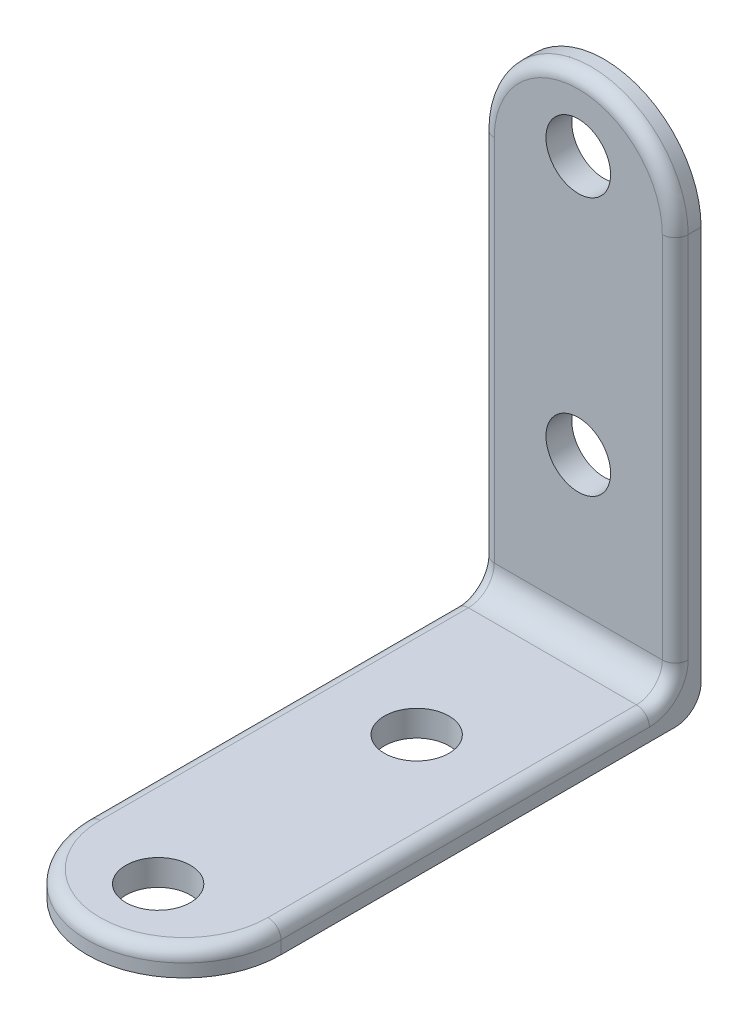
ISO-10303-21;
HEADER;
FILE_DESCRIPTION(('STEP AP214'),'2;1');
FILE_NAME('part.step','',(''),(''),'','','');
FILE_SCHEMA(('AUTOMOTIVE_DESIGN { 1 0 10303 214 1 1 1 1 }'));
ENDSEC;
DATA;
#1=APPLICATION_CONTEXT('core data for automotive mechanical design processes');
#2=APPLICATION_PROTOCOL_DEFINITION('international standard','automotive_design',2000,#1);
#3=PRODUCT_CONTEXT('',#1,'mechanical');
#4=PRODUCT('Part','Part','',(#3));
#5=PRODUCT_RELATED_PRODUCT_CATEGORY('part','',(#4));
#6=PRODUCT_DEFINITION_FORMATION('','',#4);
#7=PRODUCT_DEFINITION_CONTEXT('part definition',#1,'design');
#8=PRODUCT_DEFINITION('design','',#6,#7);
#9=PRODUCT_DEFINITION_SHAPE('','',#8);
#10=(LENGTH_UNIT() NAMED_UNIT(*) SI_UNIT(.MILLI.,.METRE.));
#11=(NAMED_UNIT(*) PLANE_ANGLE_UNIT() SI_UNIT($,.RADIAN.));
#12=(NAMED_UNIT(*) SI_UNIT($,.STERADIAN.) SOLID_ANGLE_UNIT());
#13=UNCERTAINTY_MEASURE_WITH_UNIT(LENGTH_MEASURE(1.E-05),#10,'distance_accuracy_value','');
#14=(GEOMETRIC_REPRESENTATION_CONTEXT(3) GLOBAL_UNCERTAINTY_ASSIGNED_CONTEXT((#13)) GLOBAL_UNIT_ASSIGNED_CONTEXT((#10,
#11,#12)) REPRESENTATION_CONTEXT('',''));
#15=CARTESIAN_POINT('',(0.,0.,0.));
#16=DIRECTION('',(0.,0.,1.));
#17=DIRECTION('',(1.,0.,0.));
#18=AXIS2_PLACEMENT_3D('',#15,#16,#17);
#19=CARTESIAN_POINT('',(0.,2.,0.));
#20=DIRECTION('',(0.,1.,0.));
#21=DIRECTION('',(0.,0.,1.));
#22=AXIS2_PLACEMENT_3D('',#19,#20,#21);
#23=PLANE('',#22);
#24=DIRECTION('',(-1.,0.,0.));
#25=VECTOR('',#24,1.);
#26=CARTESIAN_POINT('',(0.,2.,-28.5));
#27=LINE('',#26,#25);
#28=CARTESIAN_POINT('',(6.5,2.,-28.5));
#29=VERTEX_POINT('',#28);
#30=CARTESIAN_POINT('',(-6.5,2.,-28.5));
#31=VERTEX_POINT('',#30);
#32=EDGE_CURVE('E200',#29,#31,#27,.T.);
#33=ORIENTED_EDGE('',*,*,#32,.T.);
#34=DIRECTION('',(0.,0.,-1.));
#35=VECTOR('',#34,1.);
#36=CARTESIAN_POINT('',(-6.5,2.,0.));
#37=LINE('',#36,#35);
#38=CARTESIAN_POINT('',(-6.5,2.,0.));
#39=VERTEX_POINT('',#38);
#40=EDGE_CURVE('E216',#31,#39,#37,.F.);
#41=ORIENTED_EDGE('',*,*,#40,.T.);
#42=CARTESIAN_POINT('',(0.,2.,0.));
#43=DIRECTION('',(0.,1.,0.));
#44=DIRECTION('',(0.,0.,1.));
#45=AXIS2_PLACEMENT_3D('',#42,#43,#44);
#46=CIRCLE('',#45,6.5);
#47=CARTESIAN_POINT('',(6.5,2.,0.));
#48=VERTEX_POINT('',#47);
#49=EDGE_CURVE('E212',#39,#48,#46,.T.);
#50=ORIENTED_EDGE('',*,*,#49,.T.);
#51=DIRECTION('',(0.,0.,-1.));
#52=VECTOR('',#51,1.);
#53=CARTESIAN_POINT('',(6.5,2.,-28.5));
#54=LINE('',#53,#52);
#55=EDGE_CURVE('E214',#48,#29,#54,.T.);
#56=ORIENTED_EDGE('',*,*,#55,.T.);
#57=EDGE_LOOP('',(#33,#41,#50,#56));
#58=FACE_BOUND('',#57,.T.);
#59=CARTESIAN_POINT('',(0.,2.,2.));
#60=DIRECTION('',(0.,1.,0.));
#61=DIRECTION('',(0.,0.,1.));
#62=AXIS2_PLACEMENT_3D('',#59,#60,#61);
#63=CIRCLE('',#62,2.5);
#64=CARTESIAN_POINT('',(0.,2.,4.5));
#65=VERTEX_POINT('',#64);
#66=EDGE_CURVE('E168',#65,#65,#63,.T.);
#67=ORIENTED_EDGE('',*,*,#66,.F.);
#68=EDGE_LOOP('',(#67));
#69=FACE_BOUND('',#68,.T.);
#70=CARTESIAN_POINT('',(0.,2.,-18.));
#71=DIRECTION('',(0.,1.,0.));
#72=DIRECTION('',(0.,0.,1.));
#73=AXIS2_PLACEMENT_3D('',#70,#71,#72);
#74=CIRCLE('',#73,2.5);
#75=CARTESIAN_POINT('',(0.,2.,-15.5));
#76=VERTEX_POINT('',#75);
#77=EDGE_CURVE('E171',#76,#76,#74,.T.);
#78=ORIENTED_EDGE('',*,*,#77,.F.);
#79=EDGE_LOOP('',(#78));
#80=FACE_BOUND('',#79,.T.);
#81=ADVANCED_FACE('F40',(#58,#69,#80),#23,.T.);
#82=CARTESIAN_POINT('',(0.,2.,0.));
#83=DIRECTION('',(0.,-1.,0.));
#84=DIRECTION('',(0.,0.,-1.));
#85=AXIS2_PLACEMENT_3D('',#82,#83,#84);
#86=CYLINDRICAL_SURFACE('',#85,7.5);
#87=DIRECTION('',(0.,-1.,0.));
#88=VECTOR('',#87,1.);
#89=CARTESIAN_POINT('',(7.5,2.,0.));
#90=LINE('',#89,#88);
#91=CARTESIAN_POINT('',(7.5,1.,0.));
#92=VERTEX_POINT('',#91);
#93=CARTESIAN_POINT('',(7.5,0.,0.));
#94=VERTEX_POINT('',#93);
#95=EDGE_CURVE('E190',#92,#94,#90,.T.);
#96=ORIENTED_EDGE('',*,*,#95,.F.);
#97=CARTESIAN_POINT('',(0.,1.,0.));
#98=DIRECTION('',(0.,1.,0.));
#99=DIRECTION('',(0.,0.,1.));
#100=AXIS2_PLACEMENT_3D('',#97,#98,#99);
#101=CIRCLE('',#100,7.5);
#102=CARTESIAN_POINT('',(-7.5,1.,0.));
#103=VERTEX_POINT('',#102);
#104=EDGE_CURVE('E11',#92,#103,#101,.F.);
#105=ORIENTED_EDGE('',*,*,#104,.T.);
#106=DIRECTION('',(0.,-1.,0.));
#107=VECTOR('',#106,1.);
#108=CARTESIAN_POINT('',(-7.5,2.,0.));
#109=LINE('',#108,#107);
#110=CARTESIAN_POINT('',(-7.5,0.,0.));
#111=VERTEX_POINT('',#110);
#112=EDGE_CURVE('E152',#103,#111,#109,.T.);
#113=ORIENTED_EDGE('',*,*,#112,.T.);
#114=CARTESIAN_POINT('',(0.,0.,0.));
#115=DIRECTION('',(0.,1.,0.));
#116=DIRECTION('',(0.,0.,1.));
#117=AXIS2_PLACEMENT_3D('',#114,#115,#116);
#118=CIRCLE('',#117,7.5);
#119=EDGE_CURVE('E180',#111,#94,#118,.T.);
#120=ORIENTED_EDGE('',*,*,#119,.T.);
#121=EDGE_LOOP('',(#96,#105,#113,#120));
#122=FACE_BOUND('',#121,.T.);
#123=ADVANCED_FACE('F286',(#122),#86,.T.);
#124=CARTESIAN_POINT('',(7.5,2.,0.));
#125=DIRECTION('',(-1.,0.,0.));
#126=DIRECTION('',(0.,0.,1.));
#127=AXIS2_PLACEMENT_3D('',#124,#125,#126);
#128=PLANE('',#127);
#129=DIRECTION('',(0.,0.,-1.));
#130=VECTOR('',#129,1.);
#131=CARTESIAN_POINT('',(7.5,32.5,-30.5));
#132=LINE('',#131,#130);
#133=CARTESIAN_POINT('',(7.5,32.5,-31.5));
#134=VERTEX_POINT('',#133);
#135=CARTESIAN_POINT('',(7.5,32.5,-32.5));
#136=VERTEX_POINT('',#135);
#137=EDGE_CURVE('E140',#134,#136,#132,.T.);
#138=ORIENTED_EDGE('',*,*,#137,.F.);
#139=DIRECTION('',(0.,1.,0.));
#140=VECTOR('',#139,1.);
#141=CARTESIAN_POINT('',(7.5,2.,-31.5));
#142=LINE('',#141,#140);
#143=CARTESIAN_POINT('',(7.5,4.,-31.5));
#144=VERTEX_POINT('',#143);
#145=EDGE_CURVE('E49',#134,#144,#142,.F.);
#146=ORIENTED_EDGE('',*,*,#145,.T.);
#147=CARTESIAN_POINT('',(7.5,4.,-28.5));
#148=DIRECTION('',(-1.,0.,0.));
#149=DIRECTION('',(0.,0.,1.));
#150=AXIS2_PLACEMENT_3D('',#147,#148,#149);
#151=CIRCLE('',#150,3.);
#152=CARTESIAN_POINT('',(7.5,1.,-28.5));
#153=VERTEX_POINT('',#152);
#154=EDGE_CURVE('E61',#144,#153,#151,.T.);
#155=ORIENTED_EDGE('',*,*,#154,.T.);
#156=DIRECTION('',(0.,0.,-1.));
#157=VECTOR('',#156,1.);
#158=CARTESIAN_POINT('',(7.5,1.,0.));
#159=LINE('',#158,#157);
#160=EDGE_CURVE('E231',#153,#92,#159,.F.);
#161=ORIENTED_EDGE('',*,*,#160,.T.);
#162=ORIENTED_EDGE('',*,*,#95,.T.);
#163=DIRECTION('',(0.,0.,-1.));
#164=VECTOR('',#163,1.);
#165=CARTESIAN_POINT('',(7.5,0.,0.));
#166=LINE('',#165,#164);
#167=CARTESIAN_POINT('',(7.5,0.,-30.5));
#168=VERTEX_POINT('',#167);
#169=EDGE_CURVE('E183',#94,#168,#166,.T.);
#170=ORIENTED_EDGE('',*,*,#169,.T.);
#171=CARTESIAN_POINT('',(7.5,2.,-30.5));
#172=DIRECTION('',(-1.,0.,0.));
#173=DIRECTION('',(0.,0.,1.));
#174=AXIS2_PLACEMENT_3D('',#171,#172,#173);
#175=CIRCLE('',#174,2.);
#176=CARTESIAN_POINT('',(7.5,2.,-32.5));
#177=VERTEX_POINT('',#176);
#178=EDGE_CURVE('E195',#168,#177,#175,.F.);
#179=ORIENTED_EDGE('',*,*,#178,.T.);
#180=DIRECTION('',(0.,-1.,0.));
#181=VECTOR('',#180,1.);
#182=CARTESIAN_POINT('',(7.5,2.,-32.5));
#183=LINE('',#182,#181);
#184=EDGE_CURVE('E151',#136,#177,#183,.T.);
#185=ORIENTED_EDGE('',*,*,#184,.F.);
#186=EDGE_LOOP('',(#138,#146,#155,#161,#162,#170,#179,#185));
#187=FACE_BOUND('',#186,.T.);
#188=ADVANCED_FACE('F277',(#187),#128,.F.);
#189=CARTESIAN_POINT('',(0.,2.,-32.5));
#190=DIRECTION('',(0.,0.,-1.));
#191=DIRECTION('',(-1.,0.,0.));
#192=AXIS2_PLACEMENT_3D('',#189,#190,#191);
#193=PLANE('',#192);
#194=ORIENTED_EDGE('',*,*,#184,.T.);
#195=DIRECTION('',(1.,0.,0.));
#196=VECTOR('',#195,1.);
#197=CARTESIAN_POINT('',(-7.5,2.,-32.5));
#198=LINE('',#197,#196);
#199=CARTESIAN_POINT('',(-7.5,2.,-32.5));
#200=VERTEX_POINT('',#199);
#201=EDGE_CURVE('E150',#177,#200,#198,.F.);
#202=ORIENTED_EDGE('',*,*,#201,.T.);
#203=DIRECTION('',(0.,-1.,0.));
#204=VECTOR('',#203,1.);
#205=CARTESIAN_POINT('',(-7.5,2.,-32.5));
#206=LINE('',#205,#204);
#207=CARTESIAN_POINT('',(-7.5,32.5,-32.5));
#208=VERTEX_POINT('',#207);
#209=EDGE_CURVE('E133',#208,#200,#206,.T.);
#210=ORIENTED_EDGE('',*,*,#209,.F.);
#211=CARTESIAN_POINT('',(0.,32.5,-32.5));
#212=DIRECTION('',(0.,0.,-1.));
#213=DIRECTION('',(-1.,0.,0.));
#214=AXIS2_PLACEMENT_3D('',#211,#212,#213);
#215=CIRCLE('',#214,7.5);
#216=EDGE_CURVE('E148',#208,#136,#215,.T.);
#217=ORIENTED_EDGE('',*,*,#216,.T.);
#218=EDGE_LOOP('',(#194,#202,#210,#217));
#219=FACE_BOUND('',#218,.T.);
#220=CARTESIAN_POINT('',(0.,34.5,-32.5));
#221=DIRECTION('',(0.,0.,-1.));
#222=DIRECTION('',(-1.,0.,0.));
#223=AXIS2_PLACEMENT_3D('',#220,#221,#222);
#224=CIRCLE('',#223,2.5);
#225=CARTESIAN_POINT('',(-2.5,34.5,-32.5));
#226=VERTEX_POINT('',#225);
#227=EDGE_CURVE('E162',#226,#226,#224,.T.);
#228=ORIENTED_EDGE('',*,*,#227,.F.);
#229=EDGE_LOOP('',(#228));
#230=FACE_BOUND('',#229,.T.);
#231=CARTESIAN_POINT('',(0.,14.5,-32.5));
#232=DIRECTION('',(0.,0.,-1.));
#233=DIRECTION('',(-1.,0.,0.));
#234=AXIS2_PLACEMENT_3D('',#231,#232,#233);
#235=CIRCLE('',#234,2.5);
#236=CARTESIAN_POINT('',(-2.5,14.5,-32.5));
#237=VERTEX_POINT('',#236);
#238=EDGE_CURVE('E157',#237,#237,#235,.T.);
#239=ORIENTED_EDGE('',*,*,#238,.F.);
#240=EDGE_LOOP('',(#239));
#241=FACE_BOUND('',#240,.T.);
#242=ADVANCED_FACE('F146',(#219,#230,#241),#193,.T.);
#243=CARTESIAN_POINT('',(0.,2.,-18.));
#244=DIRECTION('',(0.,-1.,0.));
#245=DIRECTION('',(0.,0.,-1.));
#246=AXIS2_PLACEMENT_3D('',#243,#244,#245);
#247=CYLINDRICAL_SURFACE('',#246,2.5);
#248=ORIENTED_EDGE('',*,*,#77,.T.);
#249=EDGE_LOOP('',(#248));
#250=FACE_BOUND('',#249,.T.);
#251=CARTESIAN_POINT('',(0.,0.,-18.));
#252=DIRECTION('',(0.,1.,0.));
#253=DIRECTION('',(0.,0.,1.));
#254=AXIS2_PLACEMENT_3D('',#251,#252,#253);
#255=CIRCLE('',#254,2.5);
#256=CARTESIAN_POINT('',(0.,0.,-15.5));
#257=VERTEX_POINT('',#256);
#258=EDGE_CURVE('E177',#257,#257,#255,.T.);
#259=ORIENTED_EDGE('',*,*,#258,.F.);
#260=EDGE_LOOP('',(#259));
#261=FACE_BOUND('',#260,.T.);
#262=ADVANCED_FACE('F276',(#250,#261),#247,.F.);
#263=CARTESIAN_POINT('',(0.,2.,2.));
#264=DIRECTION('',(0.,-1.,0.));
#265=DIRECTION('',(0.,0.,-1.));
#266=AXIS2_PLACEMENT_3D('',#263,#264,#265);
#267=CYLINDRICAL_SURFACE('',#266,2.5);
#268=ORIENTED_EDGE('',*,*,#66,.T.);
#269=EDGE_LOOP('',(#268));
#270=FACE_BOUND('',#269,.T.);
#271=CARTESIAN_POINT('',(0.,0.,2.));
#272=DIRECTION('',(0.,1.,0.));
#273=DIRECTION('',(0.,0.,1.));
#274=AXIS2_PLACEMENT_3D('',#271,#272,#273);
#275=CIRCLE('',#274,2.5);
#276=CARTESIAN_POINT('',(0.,0.,4.5));
#277=VERTEX_POINT('',#276);
#278=EDGE_CURVE('E166',#277,#277,#275,.T.);
#279=ORIENTED_EDGE('',*,*,#278,.F.);
#280=EDGE_LOOP('',(#279));
#281=FACE_BOUND('',#280,.T.);
#282=ADVANCED_FACE('F283',(#270,#281),#267,.F.);
#283=CARTESIAN_POINT('',(-7.5,2.,0.));
#284=DIRECTION('',(-1.,0.,0.));
#285=DIRECTION('',(0.,0.,1.));
#286=AXIS2_PLACEMENT_3D('',#283,#284,#285);
#287=PLANE('',#286);
#288=ORIENTED_EDGE('',*,*,#112,.F.);
#289=DIRECTION('',(0.,0.,-1.));
#290=VECTOR('',#289,1.);
#291=CARTESIAN_POINT('',(-7.5,1.,0.));
#292=LINE('',#291,#290);
#293=CARTESIAN_POINT('',(-7.5,1.,-28.5));
#294=VERTEX_POINT('',#293);
#295=EDGE_CURVE('E209',#103,#294,#292,.T.);
#296=ORIENTED_EDGE('',*,*,#295,.T.);
#297=CARTESIAN_POINT('',(-7.5,4.,-28.5));
#298=DIRECTION('',(-1.,0.,0.));
#299=DIRECTION('',(0.,0.,1.));
#300=AXIS2_PLACEMENT_3D('',#297,#298,#299);
#301=CIRCLE('',#300,3.);
#302=CARTESIAN_POINT('',(-7.5,4.,-31.5));
#303=VERTEX_POINT('',#302);
#304=EDGE_CURVE('E207',#294,#303,#301,.F.);
#305=ORIENTED_EDGE('',*,*,#304,.T.);
#306=DIRECTION('',(0.,1.,0.));
#307=VECTOR('',#306,1.);
#308=CARTESIAN_POINT('',(-7.5,32.5,-31.5));
#309=LINE('',#308,#307);
#310=CARTESIAN_POINT('',(-7.5,32.5,-31.5));
#311=VERTEX_POINT('',#310);
#312=EDGE_CURVE('E136',#303,#311,#309,.T.);
#313=ORIENTED_EDGE('',*,*,#312,.T.);
#314=DIRECTION('',(0.,0.,-1.));
#315=VECTOR('',#314,1.);
#316=CARTESIAN_POINT('',(-7.5,32.5,-30.5));
#317=LINE('',#316,#315);
#318=EDGE_CURVE('E129',#311,#208,#317,.T.);
#319=ORIENTED_EDGE('',*,*,#318,.T.);
#320=ORIENTED_EDGE('',*,*,#209,.T.);
#321=CARTESIAN_POINT('',(-7.5,2.,-30.5));
#322=DIRECTION('',(-1.,0.,0.));
#323=DIRECTION('',(0.,0.,1.));
#324=AXIS2_PLACEMENT_3D('',#321,#322,#323);
#325=CIRCLE('',#324,2.);
#326=CARTESIAN_POINT('',(-7.5,0.,-30.5));
#327=VERTEX_POINT('',#326);
#328=EDGE_CURVE('E198',#200,#327,#325,.T.);
#329=ORIENTED_EDGE('',*,*,#328,.T.);
#330=DIRECTION('',(0.,0.,-1.));
#331=VECTOR('',#330,1.);
#332=CARTESIAN_POINT('',(-7.5,0.,0.));
#333=LINE('',#332,#331);
#334=EDGE_CURVE('E172',#111,#327,#333,.T.);
#335=ORIENTED_EDGE('',*,*,#334,.F.);
#336=EDGE_LOOP('',(#288,#296,#305,#313,#319,#320,#329,#335));
#337=FACE_BOUND('',#336,.T.);
#338=ADVANCED_FACE('F132',(#337),#287,.T.);
#339=CARTESIAN_POINT('',(0.,0.,0.));
#340=DIRECTION('',(0.,1.,0.));
#341=DIRECTION('',(0.,0.,1.));
#342=AXIS2_PLACEMENT_3D('',#339,#340,#341);
#343=PLANE('',#342);
#344=ORIENTED_EDGE('',*,*,#334,.T.);
#345=DIRECTION('',(1.,0.,0.));
#346=VECTOR('',#345,1.);
#347=CARTESIAN_POINT('',(7.5,0.,-30.5));
#348=LINE('',#347,#346);
#349=EDGE_CURVE('E192',#327,#168,#348,.T.);
#350=ORIENTED_EDGE('',*,*,#349,.T.);
#351=ORIENTED_EDGE('',*,*,#169,.F.);
#352=ORIENTED_EDGE('',*,*,#119,.F.);
#353=EDGE_LOOP('',(#344,#350,#351,#352));
#354=FACE_BOUND('',#353,.T.);
#355=ORIENTED_EDGE('',*,*,#258,.T.);
#356=EDGE_LOOP('',(#355));
#357=FACE_BOUND('',#356,.T.);
#358=ORIENTED_EDGE('',*,*,#278,.T.);
#359=EDGE_LOOP('',(#358));
#360=FACE_BOUND('',#359,.T.);
#361=ADVANCED_FACE('F271',(#354,#357,#360),#343,.F.);
#362=CARTESIAN_POINT('',(0.,14.5,-30.5));
#363=DIRECTION('',(0.,0.,-1.));
#364=DIRECTION('',(-1.,0.,0.));
#365=AXIS2_PLACEMENT_3D('',#362,#363,#364);
#366=CYLINDRICAL_SURFACE('',#365,2.5);
#367=CARTESIAN_POINT('',(0.,14.5,-30.5));
#368=DIRECTION('',(0.,0.,-1.));
#369=DIRECTION('',(-1.,0.,0.));
#370=AXIS2_PLACEMENT_3D('',#367,#368,#369);
#371=CIRCLE('',#370,2.5);
#372=CARTESIAN_POINT('',(-2.5,14.5,-30.5));
#373=VERTEX_POINT('',#372);
#374=EDGE_CURVE('E141',#373,#373,#371,.T.);
#375=ORIENTED_EDGE('',*,*,#374,.F.);
#376=EDGE_LOOP('',(#375));
#377=FACE_BOUND('',#376,.T.);
#378=ORIENTED_EDGE('',*,*,#238,.T.);
#379=EDGE_LOOP('',(#378));
#380=FACE_BOUND('',#379,.T.);
#381=ADVANCED_FACE('F267',(#377,#380),#366,.F.);
#382=CARTESIAN_POINT('',(0.,34.5,-30.5));
#383=DIRECTION('',(0.,0.,-1.));
#384=DIRECTION('',(-1.,0.,0.));
#385=AXIS2_PLACEMENT_3D('',#382,#383,#384);
#386=CYLINDRICAL_SURFACE('',#385,2.5);
#387=CARTESIAN_POINT('',(0.,34.5,-30.5));
#388=DIRECTION('',(0.,0.,-1.));
#389=DIRECTION('',(-1.,0.,0.));
#390=AXIS2_PLACEMENT_3D('',#387,#388,#389);
#391=CIRCLE('',#390,2.5);
#392=CARTESIAN_POINT('',(-2.5,34.5,-30.5));
#393=VERTEX_POINT('',#392);
#394=EDGE_CURVE('E156',#393,#393,#391,.T.);
#395=ORIENTED_EDGE('',*,*,#394,.F.);
#396=EDGE_LOOP('',(#395));
#397=FACE_BOUND('',#396,.T.);
#398=ORIENTED_EDGE('',*,*,#227,.T.);
#399=EDGE_LOOP('',(#398));
#400=FACE_BOUND('',#399,.T.);
#401=ADVANCED_FACE('F270',(#397,#400),#386,.F.);
#402=CARTESIAN_POINT('',(0.,32.5,-30.5));
#403=DIRECTION('',(0.,0.,-1.));
#404=DIRECTION('',(-1.,0.,0.));
#405=AXIS2_PLACEMENT_3D('',#402,#403,#404);
#406=CYLINDRICAL_SURFACE('',#405,7.5);
#407=ORIENTED_EDGE('',*,*,#318,.F.);
#408=CARTESIAN_POINT('',(0.,32.5,-31.5));
#409=DIRECTION('',(0.,0.,-1.));
#410=DIRECTION('',(-1.,0.,0.));
#411=AXIS2_PLACEMENT_3D('',#408,#409,#410);
#412=CIRCLE('',#411,7.5);
#413=EDGE_CURVE('E229',#311,#134,#412,.T.);
#414=ORIENTED_EDGE('',*,*,#413,.T.);
#415=ORIENTED_EDGE('',*,*,#137,.T.);
#416=ORIENTED_EDGE('',*,*,#216,.F.);
#417=EDGE_LOOP('',(#407,#414,#415,#416));
#418=FACE_BOUND('',#417,.T.);
#419=ADVANCED_FACE('F154',(#418),#406,.T.);
#420=CARTESIAN_POINT('',(0.,0.,-30.5));
#421=DIRECTION('',(0.,0.,-1.));
#422=DIRECTION('',(-1.,0.,0.));
#423=AXIS2_PLACEMENT_3D('',#420,#421,#422);
#424=PLANE('',#423);
#425=CARTESIAN_POINT('',(0.,32.5,-30.5));
#426=DIRECTION('',(0.,0.,-1.));
#427=DIRECTION('',(-1.,0.,0.));
#428=AXIS2_PLACEMENT_3D('',#425,#426,#427);
#429=CIRCLE('',#428,6.5);
#430=CARTESIAN_POINT('',(6.5,32.5,-30.5));
#431=VERTEX_POINT('',#430);
#432=CARTESIAN_POINT('',(-6.5,32.5,-30.5));
#433=VERTEX_POINT('',#432);
#434=EDGE_CURVE('E225',#431,#433,#429,.F.);
#435=ORIENTED_EDGE('',*,*,#434,.T.);
#436=DIRECTION('',(0.,1.,0.));
#437=VECTOR('',#436,1.);
#438=CARTESIAN_POINT('',(-6.5,4.,-30.5));
#439=LINE('',#438,#437);
#440=CARTESIAN_POINT('',(-6.5,4.,-30.5));
#441=VERTEX_POINT('',#440);
#442=EDGE_CURVE('E227',#433,#441,#439,.F.);
#443=ORIENTED_EDGE('',*,*,#442,.T.);
#444=DIRECTION('',(-1.,0.,0.));
#445=VECTOR('',#444,1.);
#446=CARTESIAN_POINT('',(0.,4.,-30.5));
#447=LINE('',#446,#445);
#448=CARTESIAN_POINT('',(6.5,4.,-30.5));
#449=VERTEX_POINT('',#448);
#450=EDGE_CURVE('E203',#441,#449,#447,.F.);
#451=ORIENTED_EDGE('',*,*,#450,.T.);
#452=DIRECTION('',(0.,1.,0.));
#453=VECTOR('',#452,1.);
#454=CARTESIAN_POINT('',(6.5,0.,-30.5));
#455=LINE('',#454,#453);
#456=EDGE_CURVE('E223',#449,#431,#455,.T.);
#457=ORIENTED_EDGE('',*,*,#456,.T.);
#458=EDGE_LOOP('',(#435,#443,#451,#457));
#459=FACE_BOUND('',#458,.T.);
#460=ORIENTED_EDGE('',*,*,#394,.T.);
#461=EDGE_LOOP('',(#460));
#462=FACE_BOUND('',#461,.T.);
#463=ORIENTED_EDGE('',*,*,#374,.T.);
#464=EDGE_LOOP('',(#463));
#465=FACE_BOUND('',#464,.T.);
#466=ADVANCED_FACE('F265',(#459,#462,#465),#424,.F.);
#467=CARTESIAN_POINT('',(0.,2.,-30.5));
#468=DIRECTION('',(-1.,0.,0.));
#469=DIRECTION('',(0.,0.,1.));
#470=AXIS2_PLACEMENT_3D('',#467,#468,#469);
#471=CYLINDRICAL_SURFACE('',#470,2.);
#472=ORIENTED_EDGE('',*,*,#328,.F.);
#473=ORIENTED_EDGE('',*,*,#201,.F.);
#474=ORIENTED_EDGE('',*,*,#178,.F.);
#475=ORIENTED_EDGE('',*,*,#349,.F.);
#476=EDGE_LOOP('',(#472,#473,#474,#475));
#477=FACE_BOUND('',#476,.T.);
#478=ADVANCED_FACE('F312',(#477),#471,.T.);
#479=CARTESIAN_POINT('',(0.,4.,-28.5));
#480=DIRECTION('',(-1.,0.,0.));
#481=DIRECTION('',(0.,0.,1.));
#482=AXIS2_PLACEMENT_3D('',#479,#480,#481);
#483=CYLINDRICAL_SURFACE('',#482,2.);
#484=ORIENTED_EDGE('',*,*,#450,.F.);
#485=CARTESIAN_POINT('',(-6.5,4.,-28.5));
#486=DIRECTION('',(-1.,0.,0.));
#487=DIRECTION('',(0.,0.,1.));
#488=AXIS2_PLACEMENT_3D('',#485,#486,#487);
#489=CIRCLE('',#488,2.);
#490=EDGE_CURVE('E221',#441,#31,#489,.T.);
#491=ORIENTED_EDGE('',*,*,#490,.T.);
#492=ORIENTED_EDGE('',*,*,#32,.F.);
#493=CARTESIAN_POINT('',(6.5,4.,-28.5));
#494=DIRECTION('',(-1.,0.,0.));
#495=DIRECTION('',(0.,0.,1.));
#496=AXIS2_PLACEMENT_3D('',#493,#494,#495);
#497=CIRCLE('',#496,2.);
#498=EDGE_CURVE('E219',#29,#449,#497,.F.);
#499=ORIENTED_EDGE('',*,*,#498,.T.);
#500=EDGE_LOOP('',(#484,#491,#492,#499));
#501=FACE_BOUND('',#500,.T.);
#502=ADVANCED_FACE('F315',(#501),#483,.F.);
#503=CARTESIAN_POINT('',(6.5,0.,-31.5));
#504=DIRECTION('',(0.,1.,0.));
#505=DIRECTION('',(0.,0.,1.));
#506=AXIS2_PLACEMENT_3D('',#503,#504,#505);
#507=CYLINDRICAL_SURFACE('',#506,1.);
#508=CARTESIAN_POINT('',(6.5,32.5,-31.5));
#509=DIRECTION('',(0.,1.,0.));
#510=DIRECTION('',(0.,0.,1.));
#511=AXIS2_PLACEMENT_3D('',#508,#509,#510);
#512=CIRCLE('',#511,1.);
#513=EDGE_CURVE('E250',#431,#134,#512,.T.);
#514=ORIENTED_EDGE('',*,*,#513,.F.);
#515=ORIENTED_EDGE('',*,*,#456,.F.);
#516=CARTESIAN_POINT('',(6.5,4.,-31.5));
#517=DIRECTION('',(0.,-1.,0.));
#518=DIRECTION('',(0.,0.,-1.));
#519=AXIS2_PLACEMENT_3D('',#516,#517,#518);
#520=CIRCLE('',#519,1.);
#521=EDGE_CURVE('E44',#144,#449,#520,.T.);
#522=ORIENTED_EDGE('',*,*,#521,.F.);
#523=ORIENTED_EDGE('',*,*,#145,.F.);
#524=EDGE_LOOP('',(#514,#515,#522,#523));
#525=FACE_BOUND('',#524,.T.);
#526=ADVANCED_FACE('F42',(#525),#507,.T.);
#527=CARTESIAN_POINT('',(6.5,4.,-28.5));
#528=DIRECTION('',(-1.,0.,0.));
#529=DIRECTION('',(0.,0.,1.));
#530=AXIS2_PLACEMENT_3D('',#527,#528,#529);
#531=TOROIDAL_SURFACE('',#530,3.,1.);
#532=ORIENTED_EDGE('',*,*,#521,.T.);
#533=ORIENTED_EDGE('',*,*,#498,.F.);
#534=CARTESIAN_POINT('',(6.5,1.,-28.5));
#535=DIRECTION('',(0.,0.,1.));
#536=DIRECTION('',(1.,0.,0.));
#537=AXIS2_PLACEMENT_3D('',#534,#535,#536);
#538=CIRCLE('',#537,1.);
#539=EDGE_CURVE('E248',#153,#29,#538,.T.);
#540=ORIENTED_EDGE('',*,*,#539,.F.);
#541=ORIENTED_EDGE('',*,*,#154,.F.);
#542=EDGE_LOOP('',(#532,#533,#540,#541));
#543=FACE_BOUND('',#542,.T.);
#544=ADVANCED_FACE('F342',(#543),#531,.T.);
#545=CARTESIAN_POINT('',(0.,32.5,-31.5));
#546=DIRECTION('',(0.,0.,-1.));
#547=DIRECTION('',(-1.,0.,0.));
#548=AXIS2_PLACEMENT_3D('',#545,#546,#547);
#549=TOROIDAL_SURFACE('',#548,6.5,1.);
#550=ORIENTED_EDGE('',*,*,#513,.T.);
#551=ORIENTED_EDGE('',*,*,#413,.F.);
#552=CARTESIAN_POINT('',(-6.5,32.5,-31.5));
#553=DIRECTION('',(0.,-1.,0.));
#554=DIRECTION('',(0.,0.,-1.));
#555=AXIS2_PLACEMENT_3D('',#552,#553,#554);
#556=CIRCLE('',#555,1.);
#557=EDGE_CURVE('E245',#433,#311,#556,.T.);
#558=ORIENTED_EDGE('',*,*,#557,.F.);
#559=ORIENTED_EDGE('',*,*,#434,.F.);
#560=EDGE_LOOP('',(#550,#551,#558,#559));
#561=FACE_BOUND('',#560,.T.);
#562=ADVANCED_FACE('F339',(#561),#549,.T.);
#563=CARTESIAN_POINT('',(6.5,1.,0.));
#564=DIRECTION('',(0.,0.,1.));
#565=DIRECTION('',(1.,0.,0.));
#566=AXIS2_PLACEMENT_3D('',#563,#564,#565);
#567=CYLINDRICAL_SURFACE('',#566,1.);
#568=ORIENTED_EDGE('',*,*,#539,.T.);
#569=ORIENTED_EDGE('',*,*,#55,.F.);
#570=CARTESIAN_POINT('',(6.5,1.,0.));
#571=DIRECTION('',(0.,0.,1.));
#572=DIRECTION('',(1.,0.,0.));
#573=AXIS2_PLACEMENT_3D('',#570,#571,#572);
#574=CIRCLE('',#573,1.);
#575=EDGE_CURVE('E242',#92,#48,#574,.T.);
#576=ORIENTED_EDGE('',*,*,#575,.F.);
#577=ORIENTED_EDGE('',*,*,#160,.F.);
#578=EDGE_LOOP('',(#568,#569,#576,#577));
#579=FACE_BOUND('',#578,.T.);
#580=ADVANCED_FACE('F335',(#579),#567,.T.);
#581=CARTESIAN_POINT('',(-6.5,2.,-31.5));
#582=DIRECTION('',(0.,-1.,0.));
#583=DIRECTION('',(0.,0.,-1.));
#584=AXIS2_PLACEMENT_3D('',#581,#582,#583);
#585=CYLINDRICAL_SURFACE('',#584,1.);
#586=ORIENTED_EDGE('',*,*,#557,.T.);
#587=ORIENTED_EDGE('',*,*,#312,.F.);
#588=CARTESIAN_POINT('',(-6.5,4.,-31.5));
#589=DIRECTION('',(0.,-1.,0.));
#590=DIRECTION('',(0.,0.,-1.));
#591=AXIS2_PLACEMENT_3D('',#588,#589,#590);
#592=CIRCLE('',#591,1.);
#593=EDGE_CURVE('E239',#441,#303,#592,.T.);
#594=ORIENTED_EDGE('',*,*,#593,.F.);
#595=ORIENTED_EDGE('',*,*,#442,.F.);
#596=EDGE_LOOP('',(#586,#587,#594,#595));
#597=FACE_BOUND('',#596,.T.);
#598=ADVANCED_FACE('F331',(#597),#585,.T.);
#599=CARTESIAN_POINT('',(0.,1.,0.));
#600=DIRECTION('',(0.,1.,0.));
#601=DIRECTION('',(0.,0.,1.));
#602=AXIS2_PLACEMENT_3D('',#599,#600,#601);
#603=TOROIDAL_SURFACE('',#602,6.5,1.);
#604=ORIENTED_EDGE('',*,*,#575,.T.);
#605=ORIENTED_EDGE('',*,*,#49,.F.);
#606=CARTESIAN_POINT('',(-6.5,1.,0.));
#607=DIRECTION('',(0.,0.,-1.));
#608=DIRECTION('',(-1.,0.,0.));
#609=AXIS2_PLACEMENT_3D('',#606,#607,#608);
#610=CIRCLE('',#609,1.);
#611=EDGE_CURVE('E237',#103,#39,#610,.T.);
#612=ORIENTED_EDGE('',*,*,#611,.F.);
#613=ORIENTED_EDGE('',*,*,#104,.F.);
#614=EDGE_LOOP('',(#604,#605,#612,#613));
#615=FACE_BOUND('',#614,.T.);
#616=ADVANCED_FACE('F327',(#615),#603,.T.);
#617=CARTESIAN_POINT('',(-6.5,4.,-28.5));
#618=DIRECTION('',(-1.,0.,0.));
#619=DIRECTION('',(0.,0.,1.));
#620=AXIS2_PLACEMENT_3D('',#617,#618,#619);
#621=TOROIDAL_SURFACE('',#620,3.,1.);
#622=ORIENTED_EDGE('',*,*,#593,.T.);
#623=ORIENTED_EDGE('',*,*,#304,.F.);
#624=CARTESIAN_POINT('',(-6.5,1.,-28.5));
#625=DIRECTION('',(0.,0.,1.));
#626=DIRECTION('',(1.,0.,0.));
#627=AXIS2_PLACEMENT_3D('',#624,#625,#626);
#628=CIRCLE('',#627,1.);
#629=EDGE_CURVE('E235',#31,#294,#628,.T.);
#630=ORIENTED_EDGE('',*,*,#629,.F.);
#631=ORIENTED_EDGE('',*,*,#490,.F.);
#632=EDGE_LOOP('',(#622,#623,#630,#631));
#633=FACE_BOUND('',#632,.T.);
#634=ADVANCED_FACE('F323',(#633),#621,.T.);
#635=CARTESIAN_POINT('',(-6.5,1.,0.));
#636=DIRECTION('',(0.,0.,-1.));
#637=DIRECTION('',(-1.,0.,0.));
#638=AXIS2_PLACEMENT_3D('',#635,#636,#637);
#639=CYLINDRICAL_SURFACE('',#638,1.);
#640=ORIENTED_EDGE('',*,*,#611,.T.);
#641=ORIENTED_EDGE('',*,*,#40,.F.);
#642=ORIENTED_EDGE('',*,*,#629,.T.);
#643=ORIENTED_EDGE('',*,*,#295,.F.);
#644=EDGE_LOOP('',(#640,#641,#642,#643));
#645=FACE_BOUND('',#644,.T.);
#646=ADVANCED_FACE('F320',(#645),#639,.T.);
#647=CLOSED_SHELL('',(#81,#123,#188,#242,#262,#282,#338,#361,#381,#401,#419,#466,#478,#502,#526,
#544,#562,#580,#598,#616,#634,#646));
#648=MANIFOLD_SOLID_BREP('B2',#647);
#649=ADVANCED_BREP_SHAPE_REPRESENTATION('',(#18,#648),#14);
#650=SHAPE_DEFINITION_REPRESENTATION(#9,#649);
ENDSEC;
END-ISO-10303-21;
